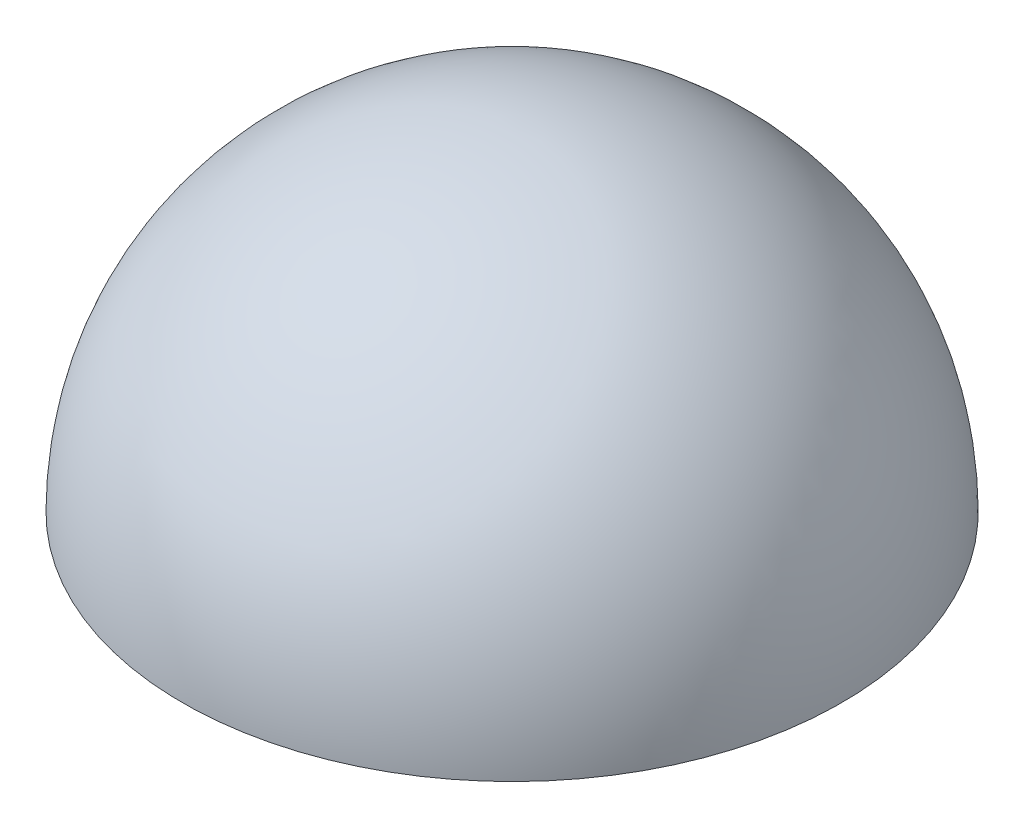
ISO-10303-21;
HEADER;
FILE_DESCRIPTION(('STEP AP214'),'2;1');
FILE_NAME('part.step','',(''),(''),'','','');
FILE_SCHEMA(('AUTOMOTIVE_DESIGN { 1 0 10303 214 1 1 1 1 }'));
ENDSEC;
DATA;
#1=APPLICATION_CONTEXT('core data for automotive mechanical design processes');
#2=APPLICATION_PROTOCOL_DEFINITION('international standard','automotive_design',2000,#1);
#3=PRODUCT_CONTEXT('',#1,'mechanical');
#4=PRODUCT('Part','Part','',(#3));
#5=PRODUCT_RELATED_PRODUCT_CATEGORY('part','',(#4));
#6=PRODUCT_DEFINITION_FORMATION('','',#4);
#7=PRODUCT_DEFINITION_CONTEXT('part definition',#1,'design');
#8=PRODUCT_DEFINITION('design','',#6,#7);
#9=PRODUCT_DEFINITION_SHAPE('','',#8);
#10=(LENGTH_UNIT() NAMED_UNIT(*) SI_UNIT(.MILLI.,.METRE.));
#11=(NAMED_UNIT(*) PLANE_ANGLE_UNIT() SI_UNIT($,.RADIAN.));
#12=(NAMED_UNIT(*) SI_UNIT($,.STERADIAN.) SOLID_ANGLE_UNIT());
#13=UNCERTAINTY_MEASURE_WITH_UNIT(LENGTH_MEASURE(1.E-05),#10,'distance_accuracy_value','');
#14=(GEOMETRIC_REPRESENTATION_CONTEXT(3) GLOBAL_UNCERTAINTY_ASSIGNED_CONTEXT((#13)) GLOBAL_UNIT_ASSIGNED_CONTEXT((#10,
#11,#12)) REPRESENTATION_CONTEXT('',''));
#15=CARTESIAN_POINT('',(0.,0.,0.));
#16=DIRECTION('',(0.,0.,1.));
#17=DIRECTION('',(1.,0.,0.));
#18=AXIS2_PLACEMENT_3D('',#15,#16,#17);
#19=CARTESIAN_POINT('',(0.,0.,0.));
#20=DIRECTION('',(-1.,0.,0.));
#21=DIRECTION('',(0.,0.,1.));
#22=AXIS2_PLACEMENT_3D('',#19,#20,#21);
#23=SPHERICAL_SURFACE('',#22,0.750000000000001);
#24=CARTESIAN_POINT('',(0.,0.,0.));
#25=DIRECTION('',(0.,-1.,0.));
#26=DIRECTION('',(0.,0.,-1.));
#27=AXIS2_PLACEMENT_3D('',#24,#25,#26);
#28=SPHERICAL_SURFACE('',#27,0.750000000000001);
#29=CARTESIAN_POINT('',(0.,0.,0.));
#30=DIRECTION('',(0.,-1.,0.));
#31=DIRECTION('',(0.,0.,-1.));
#32=AXIS2_PLACEMENT_3D('',#29,#30,#31);
#33=CIRCLE('',#32,0.750000000000001);
#34=CARTESIAN_POINT('',(0.,0.,-0.750000000000001));
#35=VERTEX_POINT('',#34);
#36=EDGE_CURVE('E10',#35,#35,#33,.T.);
#37=ORIENTED_EDGE('',*,*,#36,.F.);
#38=EDGE_LOOP('',(#37));
#39=FACE_BOUND('',#38,.T.);
#40=ADVANCED_FACE('F35',(#39),#28,.T.);
#41=CARTESIAN_POINT('',(0.,0.,0.));
#42=DIRECTION('',(0.,-1.,0.));
#43=DIRECTION('',(0.,0.,-1.));
#44=AXIS2_PLACEMENT_3D('',#41,#42,#43);
#45=PLANE('',#44);
#46=ORIENTED_EDGE('',*,*,#36,.T.);
#47=EDGE_LOOP('',(#46));
#48=FACE_BOUND('',#47,.T.);
#49=ADVANCED_FACE('F42',(#48),#45,.T.);
#50=CLOSED_SHELL('',(#40,#49));
#51=MANIFOLD_SOLID_BREP('B2',#50);
#52=ADVANCED_BREP_SHAPE_REPRESENTATION('',(#18,#51),#14);
#53=SHAPE_DEFINITION_REPRESENTATION(#9,#52);
ENDSEC;
END-ISO-10303-21;
